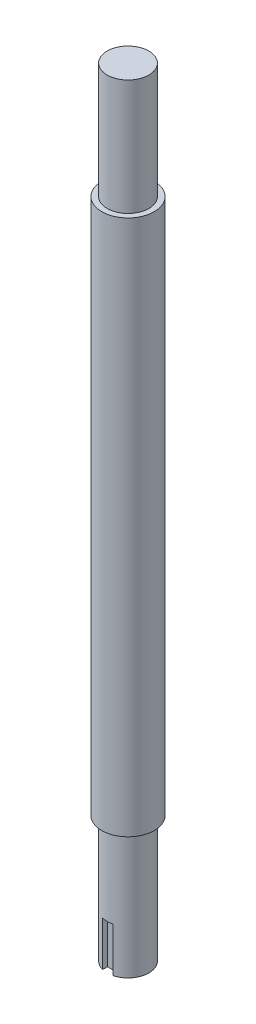
ISO-10303-21;
HEADER;
FILE_DESCRIPTION(('STEP AP214'),'2;1');
FILE_NAME('part.step','',(''),(''),'','','');
FILE_SCHEMA(('AUTOMOTIVE_DESIGN { 1 0 10303 214 1 1 1 1 }'));
ENDSEC;
DATA;
#1=APPLICATION_CONTEXT('core data for automotive mechanical design processes');
#2=APPLICATION_PROTOCOL_DEFINITION('international standard','automotive_design',2000,#1);
#3=PRODUCT_CONTEXT('',#1,'mechanical');
#4=PRODUCT('Part','Part','',(#3));
#5=PRODUCT_RELATED_PRODUCT_CATEGORY('part','',(#4));
#6=PRODUCT_DEFINITION_FORMATION('','',#4);
#7=PRODUCT_DEFINITION_CONTEXT('part definition',#1,'design');
#8=PRODUCT_DEFINITION('design','',#6,#7);
#9=PRODUCT_DEFINITION_SHAPE('','',#8);
#10=(LENGTH_UNIT() NAMED_UNIT(*) SI_UNIT(.MILLI.,.METRE.));
#11=(NAMED_UNIT(*) PLANE_ANGLE_UNIT() SI_UNIT($,.RADIAN.));
#12=(NAMED_UNIT(*) SI_UNIT($,.STERADIAN.) SOLID_ANGLE_UNIT());
#13=UNCERTAINTY_MEASURE_WITH_UNIT(LENGTH_MEASURE(1.E-05),#10,'distance_accuracy_value','');
#14=(GEOMETRIC_REPRESENTATION_CONTEXT(3) GLOBAL_UNCERTAINTY_ASSIGNED_CONTEXT((#13)) GLOBAL_UNIT_ASSIGNED_CONTEXT((#10,
#11,#12)) REPRESENTATION_CONTEXT('',''));
#15=CARTESIAN_POINT('',(0.,0.,0.));
#16=DIRECTION('',(0.,0.,1.));
#17=DIRECTION('',(1.,0.,0.));
#18=AXIS2_PLACEMENT_3D('',#15,#16,#17);
#19=CARTESIAN_POINT('',(-3.17499999999999,-227.0125,9.229725));
#20=DIRECTION('',(0.,0.,-1.));
#21=DIRECTION('',(-1.,0.,0.));
#22=AXIS2_PLACEMENT_3D('',#19,#20,#21);
#23=PLANE('',#22);
#24=DIRECTION('',(0.,1.,0.));
#25=VECTOR('',#24,1.);
#26=CARTESIAN_POINT('',(3.17500000000001,-227.0125,9.229725));
#27=LINE('',#26,#25);
#28=CARTESIAN_POINT('',(3.17500000000002,-254.,9.229725));
#29=VERTEX_POINT('',#28);
#30=CARTESIAN_POINT('',(3.17500000000001,-227.0125,9.229725));
#31=VERTEX_POINT('',#30);
#32=EDGE_CURVE('E71',#29,#31,#27,.T.);
#33=ORIENTED_EDGE('',*,*,#32,.T.);
#34=DIRECTION('',(1.,0.,0.));
#35=VECTOR('',#34,1.);
#36=CARTESIAN_POINT('',(0.,-227.0125,9.229725));
#37=LINE('',#36,#35);
#38=CARTESIAN_POINT('',(-3.17500000000001,-227.0125,9.229725));
#39=VERTEX_POINT('',#38);
#40=EDGE_CURVE('E108',#39,#31,#37,.T.);
#41=ORIENTED_EDGE('',*,*,#40,.F.);
#42=DIRECTION('',(0.,1.,0.));
#43=VECTOR('',#42,1.);
#44=CARTESIAN_POINT('',(-3.17499999999999,-227.0125,9.229725));
#45=LINE('',#44,#43);
#46=CARTESIAN_POINT('',(-3.17499999999999,-254.,9.229725));
#47=VERTEX_POINT('',#46);
#48=EDGE_CURVE('E78',#39,#47,#45,.F.);
#49=ORIENTED_EDGE('',*,*,#48,.T.);
#50=DIRECTION('',(1.,0.,0.));
#51=VECTOR('',#50,1.);
#52=CARTESIAN_POINT('',(0.,-254.,9.229725));
#53=LINE('',#52,#51);
#54=EDGE_CURVE('E88',#29,#47,#53,.F.);
#55=ORIENTED_EDGE('',*,*,#54,.F.);
#56=EDGE_LOOP('',(#33,#41,#49,#55));
#57=FACE_BOUND('',#56,.T.);
#58=ADVANCED_FACE('F17',(#57),#23,.F.);
#59=CARTESIAN_POINT('',(0.,215.9,0.));
#60=DIRECTION('',(0.,1.,0.));
#61=DIRECTION('',(0.,0.,1.));
#62=AXIS2_PLACEMENT_3D('',#59,#60,#61);
#63=PLANE('',#62);
#64=CARTESIAN_POINT('',(0.,215.9,0.));
#65=DIRECTION('',(0.,1.,0.));
#66=DIRECTION('',(0.,0.,1.));
#67=AXIS2_PLACEMENT_3D('',#64,#65,#66);
#68=CIRCLE('',#67,12.588875);
#69=CARTESIAN_POINT('',(0.,215.9,12.588875));
#70=VERTEX_POINT('',#69);
#71=EDGE_CURVE('E20',#70,#70,#68,.F.);
#72=ORIENTED_EDGE('',*,*,#71,.F.);
#73=EDGE_LOOP('',(#72));
#74=FACE_BOUND('',#73,.T.);
#75=ADVANCED_FACE('F151',(#74),#63,.T.);
#76=CARTESIAN_POINT('',(3.17500000000006,-227.0125,15.706725));
#77=DIRECTION('',(1.,0.,0.));
#78=DIRECTION('',(0.,0.,-1.));
#79=AXIS2_PLACEMENT_3D('',#76,#77,#78);
#80=PLANE('',#79);
#81=DIRECTION('',(0.,0.,-1.));
#82=VECTOR('',#81,1.);
#83=CARTESIAN_POINT('',(3.17500000000001,-227.0125,0.));
#84=LINE('',#83,#82);
#85=CARTESIAN_POINT('',(3.17500000000002,-227.0125,12.1819189278875));
#86=VERTEX_POINT('',#85);
#87=EDGE_CURVE('E84',#31,#86,#84,.F.);
#88=ORIENTED_EDGE('',*,*,#87,.F.);
#89=ORIENTED_EDGE('',*,*,#32,.F.);
#90=DIRECTION('',(0.,0.,-1.));
#91=VECTOR('',#90,1.);
#92=CARTESIAN_POINT('',(3.17500000000003,-254.,0.));
#93=LINE('',#92,#91);
#94=CARTESIAN_POINT('',(3.17500000000003,-254.,12.1819189278875));
#95=VERTEX_POINT('',#94);
#96=EDGE_CURVE('E83',#95,#29,#93,.T.);
#97=ORIENTED_EDGE('',*,*,#96,.F.);
#98=DIRECTION('',(0.,-1.,0.));
#99=VECTOR('',#98,1.);
#100=CARTESIAN_POINT('',(3.17500000000003,-177.8,12.1819189278875));
#101=LINE('',#100,#99);
#102=EDGE_CURVE('E103',#86,#95,#101,.T.);
#103=ORIENTED_EDGE('',*,*,#102,.F.);
#104=EDGE_LOOP('',(#88,#89,#97,#103));
#105=FACE_BOUND('',#104,.T.);
#106=ADVANCED_FACE('F81',(#105),#80,.F.);
#107=CARTESIAN_POINT('',(0.,-254.,0.));
#108=DIRECTION('',(0.,-1.,0.));
#109=DIRECTION('',(0.,0.,-1.));
#110=AXIS2_PLACEMENT_3D('',#107,#108,#109);
#111=PLANE('',#110);
#112=CARTESIAN_POINT('',(0.,-254.,0.));
#113=DIRECTION('',(0.,-1.,0.));
#114=DIRECTION('',(0.,0.,-1.));
#115=AXIS2_PLACEMENT_3D('',#112,#113,#114);
#116=CIRCLE('',#115,12.588875);
#117=CARTESIAN_POINT('',(-3.17500000000002,-254.,12.1819189278875));
#118=VERTEX_POINT('',#117);
#119=EDGE_CURVE('E55',#95,#118,#116,.F.);
#120=ORIENTED_EDGE('',*,*,#119,.F.);
#121=ORIENTED_EDGE('',*,*,#96,.T.);
#122=ORIENTED_EDGE('',*,*,#54,.T.);
#123=DIRECTION('',(0.,0.,1.));
#124=VECTOR('',#123,1.);
#125=CARTESIAN_POINT('',(-3.17500000000005,-254.,15.706725));
#126=LINE('',#125,#124);
#127=EDGE_CURVE('E115',#47,#118,#126,.T.);
#128=ORIENTED_EDGE('',*,*,#127,.T.);
#129=EDGE_LOOP('',(#120,#121,#122,#128));
#130=FACE_BOUND('',#129,.T.);
#131=ADVANCED_FACE('F92',(#130),#111,.T.);
#132=CARTESIAN_POINT('',(-3.17500000000005,-227.0125,15.706725));
#133=DIRECTION('',(-1.,0.,0.));
#134=DIRECTION('',(0.,0.,1.));
#135=AXIS2_PLACEMENT_3D('',#132,#133,#134);
#136=PLANE('',#135);
#137=ORIENTED_EDGE('',*,*,#127,.F.);
#138=ORIENTED_EDGE('',*,*,#48,.F.);
#139=DIRECTION('',(0.,0.,-1.));
#140=VECTOR('',#139,1.);
#141=CARTESIAN_POINT('',(-3.17500000000002,-227.0125,0.));
#142=LINE('',#141,#140);
#143=CARTESIAN_POINT('',(-3.17500000000002,-227.0125,12.1819189278875));
#144=VERTEX_POINT('',#143);
#145=EDGE_CURVE('E40',#144,#39,#142,.T.);
#146=ORIENTED_EDGE('',*,*,#145,.F.);
#147=DIRECTION('',(0.,-1.,0.));
#148=VECTOR('',#147,1.);
#149=CARTESIAN_POINT('',(-3.17500000000002,-177.8,12.1819189278875));
#150=LINE('',#149,#148);
#151=EDGE_CURVE('E132',#118,#144,#150,.F.);
#152=ORIENTED_EDGE('',*,*,#151,.F.);
#153=EDGE_LOOP('',(#137,#138,#146,#152));
#154=FACE_BOUND('',#153,.T.);
#155=ADVANCED_FACE('F185',(#154),#136,.F.);
#156=CARTESIAN_POINT('',(0.,-227.0125,0.));
#157=DIRECTION('',(0.,-1.,0.));
#158=DIRECTION('',(0.,0.,-1.));
#159=AXIS2_PLACEMENT_3D('',#156,#157,#158);
#160=PLANE('',#159);
#161=ORIENTED_EDGE('',*,*,#87,.T.);
#162=CARTESIAN_POINT('',(0.,-227.0125,0.));
#163=DIRECTION('',(0.,-1.,0.));
#164=DIRECTION('',(0.,0.,-1.));
#165=AXIS2_PLACEMENT_3D('',#162,#163,#164);
#166=CIRCLE('',#165,12.588875);
#167=EDGE_CURVE('E63',#144,#86,#166,.F.);
#168=ORIENTED_EDGE('',*,*,#167,.F.);
#169=ORIENTED_EDGE('',*,*,#145,.T.);
#170=ORIENTED_EDGE('',*,*,#40,.T.);
#171=EDGE_LOOP('',(#161,#168,#169,#170));
#172=FACE_BOUND('',#171,.T.);
#173=ADVANCED_FACE('F181',(#172),#160,.T.);
#174=CARTESIAN_POINT('',(0.,146.05,0.));
#175=DIRECTION('',(0.,1.,0.));
#176=DIRECTION('',(0.,0.,1.));
#177=AXIS2_PLACEMENT_3D('',#174,#175,#176);
#178=CYLINDRICAL_SURFACE('',#177,12.588875);
#179=CARTESIAN_POINT('',(0.,146.05,0.));
#180=DIRECTION('',(0.,1.,0.));
#181=DIRECTION('',(0.,0.,1.));
#182=AXIS2_PLACEMENT_3D('',#179,#180,#181);
#183=CIRCLE('',#182,12.588875);
#184=CARTESIAN_POINT('',(0.,146.05,12.588875));
#185=VERTEX_POINT('',#184);
#186=EDGE_CURVE('E127',#185,#185,#183,.F.);
#187=ORIENTED_EDGE('',*,*,#186,.F.);
#188=EDGE_LOOP('',(#187));
#189=FACE_BOUND('',#188,.T.);
#190=ORIENTED_EDGE('',*,*,#71,.T.);
#191=EDGE_LOOP('',(#190));
#192=FACE_BOUND('',#191,.T.);
#193=ADVANCED_FACE('F149',(#189,#192),#178,.T.);
#194=CARTESIAN_POINT('',(0.,-177.8,0.));
#195=DIRECTION('',(0.,-1.,0.));
#196=DIRECTION('',(0.,0.,-1.));
#197=AXIS2_PLACEMENT_3D('',#194,#195,#196);
#198=CYLINDRICAL_SURFACE('',#197,12.588875);
#199=CARTESIAN_POINT('',(0.,-177.8,0.));
#200=DIRECTION('',(0.,-1.,0.));
#201=DIRECTION('',(0.,0.,-1.));
#202=AXIS2_PLACEMENT_3D('',#199,#200,#201);
#203=CIRCLE('',#202,12.588875);
#204=CARTESIAN_POINT('',(0.,-177.8,-12.588875));
#205=VERTEX_POINT('',#204);
#206=EDGE_CURVE('E123',#205,#205,#203,.F.);
#207=ORIENTED_EDGE('',*,*,#206,.F.);
#208=EDGE_LOOP('',(#207));
#209=FACE_BOUND('',#208,.T.);
#210=ORIENTED_EDGE('',*,*,#151,.T.);
#211=ORIENTED_EDGE('',*,*,#167,.T.);
#212=ORIENTED_EDGE('',*,*,#102,.T.);
#213=ORIENTED_EDGE('',*,*,#119,.T.);
#214=EDGE_LOOP('',(#210,#211,#212,#213));
#215=FACE_BOUND('',#214,.T.);
#216=ADVANCED_FACE('F174',(#209,#215),#198,.T.);
#217=CARTESIAN_POINT('',(0.,146.05,0.));
#218=DIRECTION('',(0.,1.,0.));
#219=DIRECTION('',(0.,0.,1.));
#220=AXIS2_PLACEMENT_3D('',#217,#218,#219);
#221=PLANE('',#220);
#222=CARTESIAN_POINT('',(0.,146.05,0.));
#223=DIRECTION('',(0.,-1.,0.));
#224=DIRECTION('',(0.,0.,-1.));
#225=AXIS2_PLACEMENT_3D('',#222,#223,#224);
#226=CIRCLE('',#225,15.875);
#227=CARTESIAN_POINT('',(0.,146.05,-15.875));
#228=VERTEX_POINT('',#227);
#229=EDGE_CURVE('E27',#228,#228,#226,.T.);
#230=ORIENTED_EDGE('',*,*,#229,.F.);
#231=EDGE_LOOP('',(#230));
#232=FACE_BOUND('',#231,.T.);
#233=ORIENTED_EDGE('',*,*,#186,.T.);
#234=EDGE_LOOP('',(#233));
#235=FACE_BOUND('',#234,.T.);
#236=ADVANCED_FACE('F167',(#232,#235),#221,.T.);
#237=CARTESIAN_POINT('',(0.,-177.8,0.));
#238=DIRECTION('',(0.,-1.,0.));
#239=DIRECTION('',(0.,0.,-1.));
#240=AXIS2_PLACEMENT_3D('',#237,#238,#239);
#241=PLANE('',#240);
#242=CARTESIAN_POINT('',(0.,-177.8,0.));
#243=DIRECTION('',(0.,-1.,0.));
#244=DIRECTION('',(0.,0.,-1.));
#245=AXIS2_PLACEMENT_3D('',#242,#243,#244);
#246=CIRCLE('',#245,15.875);
#247=CARTESIAN_POINT('',(0.,-177.8,-15.875));
#248=VERTEX_POINT('',#247);
#249=EDGE_CURVE('E11',#248,#248,#246,.F.);
#250=ORIENTED_EDGE('',*,*,#249,.F.);
#251=EDGE_LOOP('',(#250));
#252=FACE_BOUND('',#251,.T.);
#253=ORIENTED_EDGE('',*,*,#206,.T.);
#254=EDGE_LOOP('',(#253));
#255=FACE_BOUND('',#254,.T.);
#256=ADVANCED_FACE('F161',(#252,#255),#241,.T.);
#257=CARTESIAN_POINT('',(0.,215.9,0.));
#258=DIRECTION('',(0.,-1.,0.));
#259=DIRECTION('',(0.,0.,-1.));
#260=AXIS2_PLACEMENT_3D('',#257,#258,#259);
#261=CYLINDRICAL_SURFACE('',#260,15.875);
#262=ORIENTED_EDGE('',*,*,#249,.T.);
#263=EDGE_LOOP('',(#262));
#264=FACE_BOUND('',#263,.T.);
#265=ORIENTED_EDGE('',*,*,#229,.T.);
#266=EDGE_LOOP('',(#265));
#267=FACE_BOUND('',#266,.T.);
#268=ADVANCED_FACE('F159',(#264,#267),#261,.T.);
#269=CLOSED_SHELL('',(#58,#75,#106,#131,#155,#173,#193,#216,#236,#256,#268));
#270=MANIFOLD_SOLID_BREP('B1',#269);
#271=ADVANCED_BREP_SHAPE_REPRESENTATION('',(#18,#270),#14);
#272=SHAPE_DEFINITION_REPRESENTATION(#9,#271);
ENDSEC;
END-ISO-10303-21;
